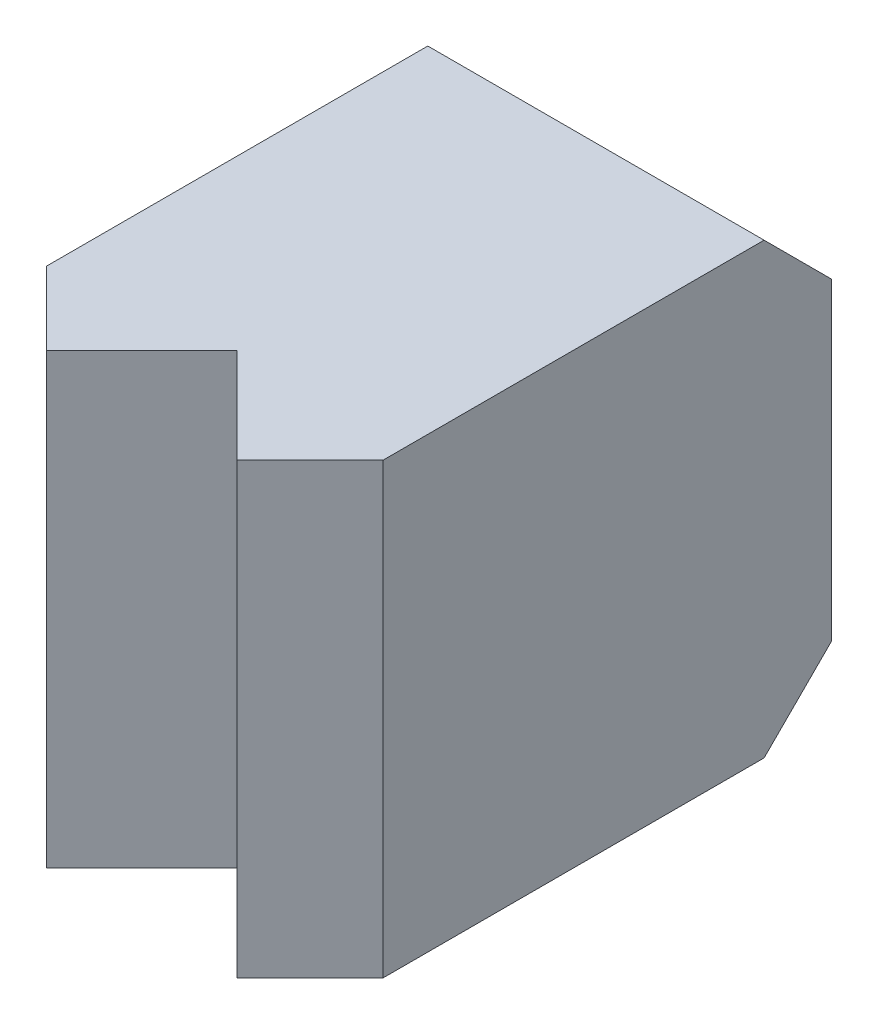
ISO-10303-21;
HEADER;
FILE_DESCRIPTION(('STEP AP214'),'2;1');
FILE_NAME('part.step','',(''),(''),'','','');
FILE_SCHEMA(('AUTOMOTIVE_DESIGN { 1 0 10303 214 1 1 1 1 }'));
ENDSEC;
DATA;
#1=APPLICATION_CONTEXT('core data for automotive mechanical design processes');
#2=APPLICATION_PROTOCOL_DEFINITION('international standard','automotive_design',2000,#1);
#3=PRODUCT_CONTEXT('',#1,'mechanical');
#4=PRODUCT('Part','Part','',(#3));
#5=PRODUCT_RELATED_PRODUCT_CATEGORY('part','',(#4));
#6=PRODUCT_DEFINITION_FORMATION('','',#4);
#7=PRODUCT_DEFINITION_CONTEXT('part definition',#1,'design');
#8=PRODUCT_DEFINITION('design','',#6,#7);
#9=PRODUCT_DEFINITION_SHAPE('','',#8);
#10=(LENGTH_UNIT() NAMED_UNIT(*) SI_UNIT(.MILLI.,.METRE.));
#11=(NAMED_UNIT(*) PLANE_ANGLE_UNIT() SI_UNIT($,.RADIAN.));
#12=(NAMED_UNIT(*) SI_UNIT($,.STERADIAN.) SOLID_ANGLE_UNIT());
#13=UNCERTAINTY_MEASURE_WITH_UNIT(LENGTH_MEASURE(1.E-05),#10,'distance_accuracy_value','');
#14=(GEOMETRIC_REPRESENTATION_CONTEXT(3) GLOBAL_UNCERTAINTY_ASSIGNED_CONTEXT((#13)) GLOBAL_UNIT_ASSIGNED_CONTEXT((#10,
#11,#12)) REPRESENTATION_CONTEXT('',''));
#15=CARTESIAN_POINT('',(0.,0.,0.));
#16=DIRECTION('',(0.,0.,1.));
#17=DIRECTION('',(1.,0.,0.));
#18=AXIS2_PLACEMENT_3D('',#15,#16,#17);
#19=CARTESIAN_POINT('',(3.25735931288072,20.,23.2573593128807));
#20=DIRECTION('',(0.707106781186547,0.,-0.707106781186548));
#21=DIRECTION('',(-0.707106781186548,0.,-0.707106781186547));
#22=AXIS2_PLACEMENT_3D('',#19,#20,#21);
#23=PLANE('',#22);
#24=DIRECTION('',(0.707106781186548,0.,0.707106781186547));
#25=VECTOR('',#24,1.);
#26=CARTESIAN_POINT('',(3.25735931288072,0.,23.2573593128807));
#27=LINE('',#26,#25);
#28=CARTESIAN_POINT('',(0.,0.,20.));
#29=VERTEX_POINT('',#28);
#30=CARTESIAN_POINT('',(3.25735931288072,0.,23.2573593128807));
#31=VERTEX_POINT('',#30);
#32=EDGE_CURVE('E140',#29,#31,#27,.T.);
#33=ORIENTED_EDGE('',*,*,#32,.T.);
#34=DIRECTION('',(0.,-1.,0.));
#35=VECTOR('',#34,1.);
#36=CARTESIAN_POINT('',(3.25735931288072,20.,23.2573593128807));
#37=LINE('',#36,#35);
#38=CARTESIAN_POINT('',(3.25735931288072,20.,23.2573593128807));
#39=VERTEX_POINT('',#38);
#40=EDGE_CURVE('E119',#39,#31,#37,.T.);
#41=ORIENTED_EDGE('',*,*,#40,.F.);
#42=DIRECTION('',(0.707106781186548,0.,0.707106781186547));
#43=VECTOR('',#42,1.);
#44=CARTESIAN_POINT('',(3.25735931288072,20.,23.2573593128807));
#45=LINE('',#44,#43);
#46=CARTESIAN_POINT('',(0.,20.,20.));
#47=VERTEX_POINT('',#46);
#48=EDGE_CURVE('E127',#47,#39,#45,.T.);
#49=ORIENTED_EDGE('',*,*,#48,.F.);
#50=DIRECTION('',(0.,-1.,0.));
#51=VECTOR('',#50,1.);
#52=CARTESIAN_POINT('',(0.,20.,20.));
#53=LINE('',#52,#51);
#54=EDGE_CURVE('E193',#47,#29,#53,.T.);
#55=ORIENTED_EDGE('',*,*,#54,.T.);
#56=EDGE_LOOP('',(#33,#41,#49,#55));
#57=FACE_BOUND('',#56,.T.);
#58=ADVANCED_FACE('F39',(#57),#23,.F.);
#59=CARTESIAN_POINT('',(3.25735931288072,20.,23.2573593128807));
#60=DIRECTION('',(-0.707106781186548,0.,-0.707106781186547));
#61=DIRECTION('',(-0.707106781186547,0.,0.707106781186548));
#62=AXIS2_PLACEMENT_3D('',#59,#60,#61);
#63=PLANE('',#62);
#64=DIRECTION('',(0.707106781186547,0.,-0.707106781186548));
#65=VECTOR('',#64,1.);
#66=CARTESIAN_POINT('',(3.25735931288072,0.,23.2573593128807));
#67=LINE('',#66,#65);
#68=CARTESIAN_POINT('',(7.5,0.,19.0147186257614));
#69=VERTEX_POINT('',#68);
#70=EDGE_CURVE('E213',#31,#69,#67,.T.);
#71=ORIENTED_EDGE('',*,*,#70,.T.);
#72=DIRECTION('',(0.,-1.,0.));
#73=VECTOR('',#72,1.);
#74=CARTESIAN_POINT('',(7.5,20.,19.0147186257614));
#75=LINE('',#74,#73);
#76=CARTESIAN_POINT('',(7.5,20.,19.0147186257614));
#77=VERTEX_POINT('',#76);
#78=EDGE_CURVE('E122',#77,#69,#75,.T.);
#79=ORIENTED_EDGE('',*,*,#78,.F.);
#80=DIRECTION('',(0.707106781186547,0.,-0.707106781186548));
#81=VECTOR('',#80,1.);
#82=CARTESIAN_POINT('',(3.25735931288072,20.,23.2573593128807));
#83=LINE('',#82,#81);
#84=EDGE_CURVE('E115',#39,#77,#83,.T.);
#85=ORIENTED_EDGE('',*,*,#84,.F.);
#86=ORIENTED_EDGE('',*,*,#40,.T.);
#87=EDGE_LOOP('',(#71,#79,#85,#86));
#88=FACE_BOUND('',#87,.T.);
#89=ADVANCED_FACE('F117',(#88),#63,.F.);
#90=CARTESIAN_POINT('',(7.5,20.,19.0147186257614));
#91=DIRECTION('',(0.707106781186547,0.,-0.707106781186548));
#92=DIRECTION('',(-0.707106781186548,0.,-0.707106781186547));
#93=AXIS2_PLACEMENT_3D('',#90,#91,#92);
#94=PLANE('',#93);
#95=DIRECTION('',(0.707106781186548,0.,0.707106781186547));
#96=VECTOR('',#95,1.);
#97=CARTESIAN_POINT('',(7.5,0.,19.0147186257614));
#98=LINE('',#97,#96);
#99=CARTESIAN_POINT('',(11.7426406871193,0.,23.2573593128807));
#100=VERTEX_POINT('',#99);
#101=EDGE_CURVE('E210',#69,#100,#98,.T.);
#102=ORIENTED_EDGE('',*,*,#101,.T.);
#103=DIRECTION('',(0.,-1.,0.));
#104=VECTOR('',#103,1.);
#105=CARTESIAN_POINT('',(11.7426406871193,20.,23.2573593128807));
#106=LINE('',#105,#104);
#107=CARTESIAN_POINT('',(11.7426406871193,20.,23.2573593128807));
#108=VERTEX_POINT('',#107);
#109=EDGE_CURVE('E148',#108,#100,#106,.T.);
#110=ORIENTED_EDGE('',*,*,#109,.F.);
#111=DIRECTION('',(0.707106781186548,0.,0.707106781186547));
#112=VECTOR('',#111,1.);
#113=CARTESIAN_POINT('',(7.5,20.,19.0147186257614));
#114=LINE('',#113,#112);
#115=EDGE_CURVE('E126',#77,#108,#114,.T.);
#116=ORIENTED_EDGE('',*,*,#115,.F.);
#117=ORIENTED_EDGE('',*,*,#78,.T.);
#118=EDGE_LOOP('',(#102,#110,#116,#117));
#119=FACE_BOUND('',#118,.T.);
#120=ADVANCED_FACE('F259',(#119),#94,.F.);
#121=CARTESIAN_POINT('',(11.7426406871193,20.,23.2573593128807));
#122=DIRECTION('',(-0.707106781186548,0.,-0.707106781186548));
#123=DIRECTION('',(-0.707106781186548,0.,0.707106781186548));
#124=AXIS2_PLACEMENT_3D('',#121,#122,#123);
#125=PLANE('',#124);
#126=DIRECTION('',(0.707106781186548,0.,-0.707106781186548));
#127=VECTOR('',#126,1.);
#128=CARTESIAN_POINT('',(11.7426406871193,0.,23.2573593128807));
#129=LINE('',#128,#127);
#130=CARTESIAN_POINT('',(15.,0.,20.));
#131=VERTEX_POINT('',#130);
#132=EDGE_CURVE('E189',#100,#131,#129,.T.);
#133=ORIENTED_EDGE('',*,*,#132,.T.);
#134=DIRECTION('',(0.,-1.,0.));
#135=VECTOR('',#134,1.);
#136=CARTESIAN_POINT('',(15.,20.,20.));
#137=LINE('',#136,#135);
#138=CARTESIAN_POINT('',(15.,20.,20.));
#139=VERTEX_POINT('',#138);
#140=EDGE_CURVE('E179',#139,#131,#137,.T.);
#141=ORIENTED_EDGE('',*,*,#140,.F.);
#142=DIRECTION('',(0.707106781186548,0.,-0.707106781186548));
#143=VECTOR('',#142,1.);
#144=CARTESIAN_POINT('',(11.7426406871193,20.,23.2573593128807));
#145=LINE('',#144,#143);
#146=EDGE_CURVE('E207',#108,#139,#145,.T.);
#147=ORIENTED_EDGE('',*,*,#146,.F.);
#148=ORIENTED_EDGE('',*,*,#109,.T.);
#149=EDGE_LOOP('',(#133,#141,#147,#148));
#150=FACE_BOUND('',#149,.T.);
#151=ADVANCED_FACE('F205',(#150),#125,.F.);
#152=CARTESIAN_POINT('',(15.,20.,0.));
#153=DIRECTION('',(-1.,0.,0.));
#154=DIRECTION('',(0.,0.,1.));
#155=AXIS2_PLACEMENT_3D('',#152,#153,#154);
#156=PLANE('',#155);
#157=DIRECTION('',(0.,0.,-1.));
#158=VECTOR('',#157,1.);
#159=CARTESIAN_POINT('',(15.,0.,0.));
#160=LINE('',#159,#158);
#161=CARTESIAN_POINT('',(15.,0.,3.00000000000001));
#162=VERTEX_POINT('',#161);
#163=EDGE_CURVE('E170',#131,#162,#160,.T.);
#164=ORIENTED_EDGE('',*,*,#163,.T.);
#165=DIRECTION('',(0.,0.707106781186546,-0.707106781186549));
#166=VECTOR('',#165,1.);
#167=CARTESIAN_POINT('',(15.,3.,0.));
#168=LINE('',#167,#166);
#169=CARTESIAN_POINT('',(15.,3.,0.));
#170=VERTEX_POINT('',#169);
#171=EDGE_CURVE('E48',#162,#170,#168,.T.);
#172=ORIENTED_EDGE('',*,*,#171,.T.);
#173=DIRECTION('',(0.,-1.,0.));
#174=VECTOR('',#173,1.);
#175=CARTESIAN_POINT('',(15.,20.,0.));
#176=LINE('',#175,#174);
#177=CARTESIAN_POINT('',(15.,17.,0.));
#178=VERTEX_POINT('',#177);
#179=EDGE_CURVE('E168',#178,#170,#176,.T.);
#180=ORIENTED_EDGE('',*,*,#179,.F.);
#181=DIRECTION('',(0.,-0.707106781186549,-0.707106781186546));
#182=VECTOR('',#181,1.);
#183=CARTESIAN_POINT('',(15.,20.,3.));
#184=LINE('',#183,#182);
#185=CARTESIAN_POINT('',(15.,20.,2.99999999999999));
#186=VERTEX_POINT('',#185);
#187=EDGE_CURVE('E55',#178,#186,#184,.F.);
#188=ORIENTED_EDGE('',*,*,#187,.T.);
#189=DIRECTION('',(0.,0.,-1.));
#190=VECTOR('',#189,1.);
#191=CARTESIAN_POINT('',(15.,20.,0.));
#192=LINE('',#191,#190);
#193=EDGE_CURVE('E223',#139,#186,#192,.T.);
#194=ORIENTED_EDGE('',*,*,#193,.F.);
#195=ORIENTED_EDGE('',*,*,#140,.T.);
#196=EDGE_LOOP('',(#164,#172,#180,#188,#194,#195));
#197=FACE_BOUND('',#196,.T.);
#198=ADVANCED_FACE('F167',(#197),#156,.F.);
#199=CARTESIAN_POINT('',(0.,20.,0.));
#200=DIRECTION('',(0.,0.,1.));
#201=DIRECTION('',(1.,0.,0.));
#202=AXIS2_PLACEMENT_3D('',#199,#200,#201);
#203=PLANE('',#202);
#204=CARTESIAN_POINT('',(7.5,10.,0.));
#205=DIRECTION('',(0.,0.,-1.));
#206=DIRECTION('',(-1.,0.,0.));
#207=AXIS2_PLACEMENT_3D('',#204,#205,#206);
#208=CIRCLE('',#207,5.);
#209=CARTESIAN_POINT('',(2.5,10.,0.));
#210=VERTEX_POINT('',#209);
#211=EDGE_CURVE('E230',#210,#210,#208,.T.);
#212=ORIENTED_EDGE('',*,*,#211,.F.);
#213=EDGE_LOOP('',(#212));
#214=FACE_BOUND('',#213,.T.);
#215=ORIENTED_EDGE('',*,*,#179,.T.);
#216=DIRECTION('',(-1.,0.,0.));
#217=VECTOR('',#216,1.);
#218=CARTESIAN_POINT('',(0.,3.,0.));
#219=LINE('',#218,#217);
#220=CARTESIAN_POINT('',(0.,3.,0.));
#221=VERTEX_POINT('',#220);
#222=EDGE_CURVE('E146',#170,#221,#219,.T.);
#223=ORIENTED_EDGE('',*,*,#222,.T.);
#224=DIRECTION('',(0.,-1.,0.));
#225=VECTOR('',#224,1.);
#226=CARTESIAN_POINT('',(0.,20.,0.));
#227=LINE('',#226,#225);
#228=CARTESIAN_POINT('',(0.,17.,0.));
#229=VERTEX_POINT('',#228);
#230=EDGE_CURVE('E180',#229,#221,#227,.T.);
#231=ORIENTED_EDGE('',*,*,#230,.F.);
#232=DIRECTION('',(1.,0.,0.));
#233=VECTOR('',#232,1.);
#234=CARTESIAN_POINT('',(0.,17.,0.));
#235=LINE('',#234,#233);
#236=EDGE_CURVE('E142',#229,#178,#235,.T.);
#237=ORIENTED_EDGE('',*,*,#236,.T.);
#238=EDGE_LOOP('',(#215,#223,#231,#237));
#239=FACE_BOUND('',#238,.T.);
#240=ADVANCED_FACE('F174',(#214,#239),#203,.F.);
#241=CARTESIAN_POINT('',(0.,20.,0.));
#242=DIRECTION('',(1.,0.,0.));
#243=DIRECTION('',(0.,0.,-1.));
#244=AXIS2_PLACEMENT_3D('',#241,#242,#243);
#245=PLANE('',#244);
#246=ORIENTED_EDGE('',*,*,#230,.T.);
#247=DIRECTION('',(0.,-0.707106781186546,0.707106781186549));
#248=VECTOR('',#247,1.);
#249=CARTESIAN_POINT('',(0.,3.,0.));
#250=LINE('',#249,#248);
#251=CARTESIAN_POINT('',(0.,0.,3.00000000000001));
#252=VERTEX_POINT('',#251);
#253=EDGE_CURVE('E158',#221,#252,#250,.T.);
#254=ORIENTED_EDGE('',*,*,#253,.T.);
#255=DIRECTION('',(0.,0.,1.));
#256=VECTOR('',#255,1.);
#257=CARTESIAN_POINT('',(0.,0.,0.));
#258=LINE('',#257,#256);
#259=EDGE_CURVE('E137',#252,#29,#258,.T.);
#260=ORIENTED_EDGE('',*,*,#259,.T.);
#261=ORIENTED_EDGE('',*,*,#54,.F.);
#262=DIRECTION('',(0.,0.,1.));
#263=VECTOR('',#262,1.);
#264=CARTESIAN_POINT('',(0.,20.,0.));
#265=LINE('',#264,#263);
#266=CARTESIAN_POINT('',(0.,20.,3.));
#267=VERTEX_POINT('',#266);
#268=EDGE_CURVE('E132',#267,#47,#265,.T.);
#269=ORIENTED_EDGE('',*,*,#268,.F.);
#270=DIRECTION('',(0.,0.707106781186549,0.707106781186546));
#271=VECTOR('',#270,1.);
#272=CARTESIAN_POINT('',(0.,20.,3.));
#273=LINE('',#272,#271);
#274=EDGE_CURVE('E155',#267,#229,#273,.F.);
#275=ORIENTED_EDGE('',*,*,#274,.T.);
#276=EDGE_LOOP('',(#246,#254,#260,#261,#269,#275));
#277=FACE_BOUND('',#276,.T.);
#278=ADVANCED_FACE('F184',(#277),#245,.F.);
#279=CARTESIAN_POINT('',(0.,20.,0.));
#280=DIRECTION('',(0.,-1.,0.));
#281=DIRECTION('',(0.,0.,-1.));
#282=AXIS2_PLACEMENT_3D('',#279,#280,#281);
#283=PLANE('',#282);
#284=ORIENTED_EDGE('',*,*,#193,.T.);
#285=DIRECTION('',(-1.,0.,0.));
#286=VECTOR('',#285,1.);
#287=CARTESIAN_POINT('',(0.,20.,3.));
#288=LINE('',#287,#286);
#289=EDGE_CURVE('E11',#186,#267,#288,.T.);
#290=ORIENTED_EDGE('',*,*,#289,.T.);
#291=ORIENTED_EDGE('',*,*,#268,.T.);
#292=ORIENTED_EDGE('',*,*,#48,.T.);
#293=ORIENTED_EDGE('',*,*,#84,.T.);
#294=ORIENTED_EDGE('',*,*,#115,.T.);
#295=ORIENTED_EDGE('',*,*,#146,.T.);
#296=EDGE_LOOP('',(#284,#290,#291,#292,#293,#294,#295));
#297=FACE_BOUND('',#296,.T.);
#298=ADVANCED_FACE('F130',(#297),#283,.F.);
#299=CARTESIAN_POINT('',(0.,0.,0.));
#300=DIRECTION('',(0.,-1.,0.));
#301=DIRECTION('',(0.,0.,-1.));
#302=AXIS2_PLACEMENT_3D('',#299,#300,#301);
#303=PLANE('',#302);
#304=ORIENTED_EDGE('',*,*,#259,.F.);
#305=DIRECTION('',(1.,0.,0.));
#306=VECTOR('',#305,1.);
#307=CARTESIAN_POINT('',(15.,0.,3.00000000000001));
#308=LINE('',#307,#306);
#309=EDGE_CURVE('E63',#252,#162,#308,.T.);
#310=ORIENTED_EDGE('',*,*,#309,.T.);
#311=ORIENTED_EDGE('',*,*,#163,.F.);
#312=ORIENTED_EDGE('',*,*,#132,.F.);
#313=ORIENTED_EDGE('',*,*,#101,.F.);
#314=ORIENTED_EDGE('',*,*,#70,.F.);
#315=ORIENTED_EDGE('',*,*,#32,.F.);
#316=EDGE_LOOP('',(#304,#310,#311,#312,#313,#314,#315));
#317=FACE_BOUND('',#316,.T.);
#318=ADVANCED_FACE('F185',(#317),#303,.T.);
#319=CARTESIAN_POINT('',(7.50000000000001,10.,18.));
#320=DIRECTION('',(0.,0.,-1.));
#321=DIRECTION('',(-1.,0.,0.));
#322=AXIS2_PLACEMENT_3D('',#319,#320,#321);
#323=CYLINDRICAL_SURFACE('',#322,5.);
#324=CARTESIAN_POINT('',(7.50000000000001,10.,18.));
#325=DIRECTION('',(0.,0.,-1.));
#326=DIRECTION('',(-1.,0.,0.));
#327=AXIS2_PLACEMENT_3D('',#324,#325,#326);
#328=CIRCLE('',#327,5.);
#329=CARTESIAN_POINT('',(2.5,10.,18.));
#330=VERTEX_POINT('',#329);
#331=EDGE_CURVE('E220',#330,#330,#328,.T.);
#332=ORIENTED_EDGE('',*,*,#331,.F.);
#333=EDGE_LOOP('',(#332));
#334=FACE_BOUND('',#333,.T.);
#335=ORIENTED_EDGE('',*,*,#211,.T.);
#336=EDGE_LOOP('',(#335));
#337=FACE_BOUND('',#336,.T.);
#338=ADVANCED_FACE('F240',(#334,#337),#323,.F.);
#339=CARTESIAN_POINT('',(7.50000000000001,10.,18.));
#340=DIRECTION('',(0.,0.,-1.));
#341=DIRECTION('',(-1.,0.,0.));
#342=AXIS2_PLACEMENT_3D('',#339,#340,#341);
#343=PLANE('',#342);
#344=ORIENTED_EDGE('',*,*,#331,.T.);
#345=EDGE_LOOP('',(#344));
#346=FACE_BOUND('',#345,.T.);
#347=ADVANCED_FACE('F238',(#346),#343,.T.);
#348=CARTESIAN_POINT('',(0.,3.,0.));
#349=DIRECTION('',(0.,-0.707106781186549,-0.707106781186546));
#350=DIRECTION('',(1.,0.,0.));
#351=AXIS2_PLACEMENT_3D('',#348,#349,#350);
#352=PLANE('',#351);
#353=ORIENTED_EDGE('',*,*,#171,.F.);
#354=ORIENTED_EDGE('',*,*,#309,.F.);
#355=ORIENTED_EDGE('',*,*,#253,.F.);
#356=ORIENTED_EDGE('',*,*,#222,.F.);
#357=EDGE_LOOP('',(#353,#354,#355,#356));
#358=FACE_BOUND('',#357,.T.);
#359=ADVANCED_FACE('F182',(#358),#352,.T.);
#360=CARTESIAN_POINT('',(0.,20.,3.));
#361=DIRECTION('',(0.,-0.707106781186546,0.707106781186549));
#362=DIRECTION('',(-1.,0.,0.));
#363=AXIS2_PLACEMENT_3D('',#360,#361,#362);
#364=PLANE('',#363);
#365=ORIENTED_EDGE('',*,*,#187,.F.);
#366=ORIENTED_EDGE('',*,*,#236,.F.);
#367=ORIENTED_EDGE('',*,*,#274,.F.);
#368=ORIENTED_EDGE('',*,*,#289,.F.);
#369=EDGE_LOOP('',(#365,#366,#367,#368));
#370=FACE_BOUND('',#369,.T.);
#371=ADVANCED_FACE('F41',(#370),#364,.F.);
#372=CLOSED_SHELL('',(#58,#89,#120,#151,#198,#240,#278,#298,#318,#338,#347,#359,#371));
#373=MANIFOLD_SOLID_BREP('B2',#372);
#374=ADVANCED_BREP_SHAPE_REPRESENTATION('',(#18,#373),#14);
#375=SHAPE_DEFINITION_REPRESENTATION(#9,#374);
ENDSEC;
END-ISO-10303-21;
